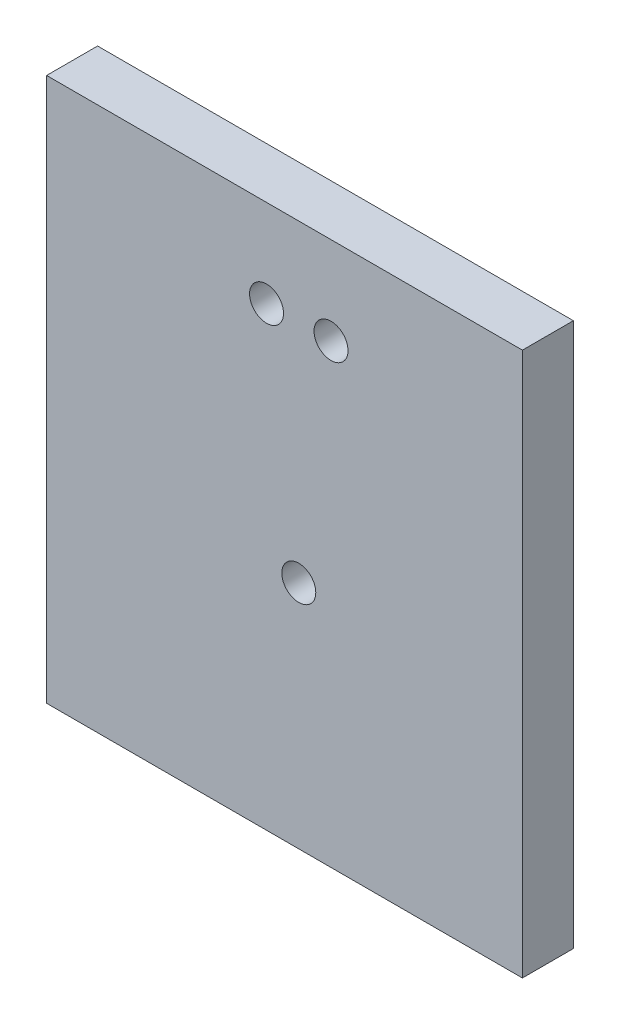
ISO-10303-21;
HEADER;
FILE_DESCRIPTION(('STEP AP214'),'2;1');
FILE_NAME('part.step','',(''),(''),'','','');
FILE_SCHEMA(('AUTOMOTIVE_DESIGN { 1 0 10303 214 1 1 1 1 }'));
ENDSEC;
DATA;
#1=APPLICATION_CONTEXT('core data for automotive mechanical design processes');
#2=APPLICATION_PROTOCOL_DEFINITION('international standard','automotive_design',2000,#1);
#3=PRODUCT_CONTEXT('',#1,'mechanical');
#4=PRODUCT('Part','Part','',(#3));
#5=PRODUCT_RELATED_PRODUCT_CATEGORY('part','',(#4));
#6=PRODUCT_DEFINITION_FORMATION('','',#4);
#7=PRODUCT_DEFINITION_CONTEXT('part definition',#1,'design');
#8=PRODUCT_DEFINITION('design','',#6,#7);
#9=PRODUCT_DEFINITION_SHAPE('','',#8);
#10=(LENGTH_UNIT() NAMED_UNIT(*) SI_UNIT(.MILLI.,.METRE.));
#11=(NAMED_UNIT(*) PLANE_ANGLE_UNIT() SI_UNIT($,.RADIAN.));
#12=(NAMED_UNIT(*) SI_UNIT($,.STERADIAN.) SOLID_ANGLE_UNIT());
#13=UNCERTAINTY_MEASURE_WITH_UNIT(LENGTH_MEASURE(1.E-05),#10,'distance_accuracy_value','');
#14=(GEOMETRIC_REPRESENTATION_CONTEXT(3) GLOBAL_UNCERTAINTY_ASSIGNED_CONTEXT((#13)) GLOBAL_UNIT_ASSIGNED_CONTEXT((#10,
#11,#12)) REPRESENTATION_CONTEXT('',''));
#15=CARTESIAN_POINT('',(0.,0.,0.));
#16=DIRECTION('',(0.,0.,1.));
#17=DIRECTION('',(1.,0.,0.));
#18=AXIS2_PLACEMENT_3D('',#15,#16,#17);
#19=CARTESIAN_POINT('',(0.,0.,9.525));
#20=DIRECTION('',(-1.,0.,0.));
#21=DIRECTION('',(0.,-1.,0.));
#22=AXIS2_PLACEMENT_3D('',#19,#20,#21);
#23=PLANE('',#22);
#24=DIRECTION('',(0.,1.,0.));
#25=VECTOR('',#24,1.);
#26=CARTESIAN_POINT('',(0.,0.,0.));
#27=LINE('',#26,#25);
#28=CARTESIAN_POINT('',(0.,0.,0.));
#29=VERTEX_POINT('',#28);
#30=CARTESIAN_POINT('',(0.,101.6,0.));
#31=VERTEX_POINT('',#30);
#32=EDGE_CURVE('E96',#29,#31,#27,.T.);
#33=ORIENTED_EDGE('',*,*,#32,.T.);
#34=DIRECTION('',(0.,0.,-1.));
#35=VECTOR('',#34,1.);
#36=CARTESIAN_POINT('',(0.,101.6,9.525));
#37=LINE('',#36,#35);
#38=CARTESIAN_POINT('',(0.,101.6,9.525));
#39=VERTEX_POINT('',#38);
#40=EDGE_CURVE('E11',#39,#31,#37,.T.);
#41=ORIENTED_EDGE('',*,*,#40,.F.);
#42=DIRECTION('',(0.,1.,0.));
#43=VECTOR('',#42,1.);
#44=CARTESIAN_POINT('',(0.,0.,9.525));
#45=LINE('',#44,#43);
#46=CARTESIAN_POINT('',(0.,0.,9.525));
#47=VERTEX_POINT('',#46);
#48=EDGE_CURVE('E84',#47,#39,#45,.T.);
#49=ORIENTED_EDGE('',*,*,#48,.F.);
#50=DIRECTION('',(0.,0.,-1.));
#51=VECTOR('',#50,1.);
#52=CARTESIAN_POINT('',(0.,0.,9.525));
#53=LINE('',#52,#51);
#54=EDGE_CURVE('E92',#47,#29,#53,.T.);
#55=ORIENTED_EDGE('',*,*,#54,.T.);
#56=EDGE_LOOP('',(#33,#41,#49,#55));
#57=FACE_BOUND('',#56,.T.);
#58=ADVANCED_FACE('F33',(#57),#23,.F.);
#59=CARTESIAN_POINT('',(0.,101.6,9.525));
#60=DIRECTION('',(0.,-1.,0.));
#61=DIRECTION('',(1.,0.,0.));
#62=AXIS2_PLACEMENT_3D('',#59,#60,#61);
#63=PLANE('',#62);
#64=DIRECTION('',(-1.,0.,0.));
#65=VECTOR('',#64,1.);
#66=CARTESIAN_POINT('',(0.,101.6,0.));
#67=LINE('',#66,#65);
#68=CARTESIAN_POINT('',(-88.9,101.6,0.));
#69=VERTEX_POINT('',#68);
#70=EDGE_CURVE('E88',#31,#69,#67,.T.);
#71=ORIENTED_EDGE('',*,*,#70,.T.);
#72=DIRECTION('',(0.,0.,-1.));
#73=VECTOR('',#72,1.);
#74=CARTESIAN_POINT('',(-88.9,101.6,9.525));
#75=LINE('',#74,#73);
#76=CARTESIAN_POINT('',(-88.9,101.6,9.525));
#77=VERTEX_POINT('',#76);
#78=EDGE_CURVE('E41',#77,#69,#75,.T.);
#79=ORIENTED_EDGE('',*,*,#78,.F.);
#80=DIRECTION('',(-1.,0.,0.));
#81=VECTOR('',#80,1.);
#82=CARTESIAN_POINT('',(0.,101.6,9.525));
#83=LINE('',#82,#81);
#84=EDGE_CURVE('E79',#39,#77,#83,.T.);
#85=ORIENTED_EDGE('',*,*,#84,.F.);
#86=ORIENTED_EDGE('',*,*,#40,.T.);
#87=EDGE_LOOP('',(#71,#79,#85,#86));
#88=FACE_BOUND('',#87,.T.);
#89=ADVANCED_FACE('F87',(#88),#63,.F.);
#90=CARTESIAN_POINT('',(-88.9,0.,9.525));
#91=DIRECTION('',(1.,0.,0.));
#92=DIRECTION('',(0.,0.,-1.));
#93=AXIS2_PLACEMENT_3D('',#90,#91,#92);
#94=PLANE('',#93);
#95=DIRECTION('',(0.,-1.,0.));
#96=VECTOR('',#95,1.);
#97=CARTESIAN_POINT('',(-88.9,0.,0.));
#98=LINE('',#97,#96);
#99=CARTESIAN_POINT('',(-88.9,0.,0.));
#100=VERTEX_POINT('',#99);
#101=EDGE_CURVE('E66',#69,#100,#98,.T.);
#102=ORIENTED_EDGE('',*,*,#101,.T.);
#103=DIRECTION('',(0.,0.,-1.));
#104=VECTOR('',#103,1.);
#105=CARTESIAN_POINT('',(-88.9,0.,9.525));
#106=LINE('',#105,#104);
#107=CARTESIAN_POINT('',(-88.9,0.,9.525));
#108=VERTEX_POINT('',#107);
#109=EDGE_CURVE('E89',#108,#100,#106,.T.);
#110=ORIENTED_EDGE('',*,*,#109,.F.);
#111=DIRECTION('',(0.,-1.,0.));
#112=VECTOR('',#111,1.);
#113=CARTESIAN_POINT('',(-88.9,0.,9.525));
#114=LINE('',#113,#112);
#115=EDGE_CURVE('E82',#77,#108,#114,.T.);
#116=ORIENTED_EDGE('',*,*,#115,.F.);
#117=ORIENTED_EDGE('',*,*,#78,.T.);
#118=EDGE_LOOP('',(#102,#110,#116,#117));
#119=FACE_BOUND('',#118,.T.);
#120=ADVANCED_FACE('F90',(#119),#94,.F.);
#121=CARTESIAN_POINT('',(0.,0.,9.525));
#122=DIRECTION('',(0.,1.,0.));
#123=DIRECTION('',(-1.,0.,0.));
#124=AXIS2_PLACEMENT_3D('',#121,#122,#123);
#125=PLANE('',#124);
#126=DIRECTION('',(1.,0.,0.));
#127=VECTOR('',#126,1.);
#128=CARTESIAN_POINT('',(0.,0.,0.));
#129=LINE('',#128,#127);
#130=EDGE_CURVE('E72',#100,#29,#129,.T.);
#131=ORIENTED_EDGE('',*,*,#130,.T.);
#132=ORIENTED_EDGE('',*,*,#54,.F.);
#133=DIRECTION('',(1.,0.,0.));
#134=VECTOR('',#133,1.);
#135=CARTESIAN_POINT('',(0.,0.,9.525));
#136=LINE('',#135,#134);
#137=EDGE_CURVE('E49',#108,#47,#136,.T.);
#138=ORIENTED_EDGE('',*,*,#137,.F.);
#139=ORIENTED_EDGE('',*,*,#109,.T.);
#140=EDGE_LOOP('',(#131,#132,#138,#139));
#141=FACE_BOUND('',#140,.T.);
#142=ADVANCED_FACE('F104',(#141),#125,.F.);
#143=CARTESIAN_POINT('',(0.,0.,9.525));
#144=DIRECTION('',(0.,0.,1.));
#145=DIRECTION('',(1.,0.,0.));
#146=AXIS2_PLACEMENT_3D('',#143,#144,#145);
#147=PLANE('',#146);
#148=CARTESIAN_POINT('',(-47.807859020382,85.2202821492196,9.525));
#149=DIRECTION('',(0.,0.,1.));
#150=DIRECTION('',(1.,0.,0.));
#151=AXIS2_PLACEMENT_3D('',#148,#149,#150);
#152=CIRCLE('',#151,3.17499999999998);
#153=CARTESIAN_POINT('',(-44.6328590203821,85.2202821492196,9.525));
#154=VERTEX_POINT('',#153);
#155=EDGE_CURVE('E124',#154,#154,#152,.T.);
#156=ORIENTED_EDGE('',*,*,#155,.F.);
#157=EDGE_LOOP('',(#156));
#158=FACE_BOUND('',#157,.T.);
#159=CARTESIAN_POINT('',(-35.7595811351405,85.2202821492196,9.525));
#160=DIRECTION('',(0.,0.,1.));
#161=DIRECTION('',(1.,0.,0.));
#162=AXIS2_PLACEMENT_3D('',#159,#160,#161);
#163=CIRCLE('',#162,3.17499999999999);
#164=CARTESIAN_POINT('',(-32.5845811351405,85.2202821492196,9.525));
#165=VERTEX_POINT('',#164);
#166=EDGE_CURVE('E118',#165,#165,#163,.T.);
#167=ORIENTED_EDGE('',*,*,#166,.F.);
#168=EDGE_LOOP('',(#167));
#169=FACE_BOUND('',#168,.T.);
#170=CARTESIAN_POINT('',(-41.7837200777613,43.0513095508742,9.525));
#171=DIRECTION('',(0.,0.,1.));
#172=DIRECTION('',(1.,0.,0.));
#173=AXIS2_PLACEMENT_3D('',#170,#171,#172);
#174=CIRCLE('',#173,3.17499999999999);
#175=CARTESIAN_POINT('',(-38.6087200777613,43.0513095508742,9.525));
#176=VERTEX_POINT('',#175);
#177=EDGE_CURVE('E112',#176,#176,#174,.T.);
#178=ORIENTED_EDGE('',*,*,#177,.F.);
#179=EDGE_LOOP('',(#178));
#180=FACE_BOUND('',#179,.T.);
#181=ORIENTED_EDGE('',*,*,#48,.T.);
#182=ORIENTED_EDGE('',*,*,#84,.T.);
#183=ORIENTED_EDGE('',*,*,#115,.T.);
#184=ORIENTED_EDGE('',*,*,#137,.T.);
#185=EDGE_LOOP('',(#181,#182,#183,#184));
#186=FACE_BOUND('',#185,.T.);
#187=ADVANCED_FACE('F80',(#158,#169,#180,#186),#147,.T.);
#188=CARTESIAN_POINT('',(0.,0.,0.));
#189=DIRECTION('',(0.,0.,1.));
#190=DIRECTION('',(1.,0.,0.));
#191=AXIS2_PLACEMENT_3D('',#188,#189,#190);
#192=PLANE('',#191);
#193=CARTESIAN_POINT('',(-47.807859020382,85.2202821492196,0.));
#194=DIRECTION('',(0.,0.,1.));
#195=DIRECTION('',(1.,0.,0.));
#196=AXIS2_PLACEMENT_3D('',#193,#194,#195);
#197=CIRCLE('',#196,3.17499999999999);
#198=CARTESIAN_POINT('',(-44.632859020382,85.2202821492196,0.));
#199=VERTEX_POINT('',#198);
#200=EDGE_CURVE('E121',#199,#199,#197,.T.);
#201=ORIENTED_EDGE('',*,*,#200,.T.);
#202=EDGE_LOOP('',(#201));
#203=FACE_BOUND('',#202,.T.);
#204=CARTESIAN_POINT('',(-35.7595811351405,85.2202821492196,0.));
#205=DIRECTION('',(0.,0.,1.));
#206=DIRECTION('',(1.,0.,0.));
#207=AXIS2_PLACEMENT_3D('',#204,#205,#206);
#208=CIRCLE('',#207,3.17499999999999);
#209=CARTESIAN_POINT('',(-32.5845811351405,85.2202821492196,0.));
#210=VERTEX_POINT('',#209);
#211=EDGE_CURVE('E115',#210,#210,#208,.T.);
#212=ORIENTED_EDGE('',*,*,#211,.T.);
#213=EDGE_LOOP('',(#212));
#214=FACE_BOUND('',#213,.T.);
#215=CARTESIAN_POINT('',(-41.7837200777613,43.0513095508742,0.));
#216=DIRECTION('',(0.,0.,1.));
#217=DIRECTION('',(1.,0.,0.));
#218=AXIS2_PLACEMENT_3D('',#215,#216,#217);
#219=CIRCLE('',#218,3.17499999999999);
#220=CARTESIAN_POINT('',(-38.6087200777613,43.0513095508742,0.));
#221=VERTEX_POINT('',#220);
#222=EDGE_CURVE('E99',#221,#221,#219,.T.);
#223=ORIENTED_EDGE('',*,*,#222,.T.);
#224=EDGE_LOOP('',(#223));
#225=FACE_BOUND('',#224,.T.);
#226=ORIENTED_EDGE('',*,*,#32,.F.);
#227=ORIENTED_EDGE('',*,*,#130,.F.);
#228=ORIENTED_EDGE('',*,*,#101,.F.);
#229=ORIENTED_EDGE('',*,*,#70,.F.);
#230=EDGE_LOOP('',(#226,#227,#228,#229));
#231=FACE_BOUND('',#230,.T.);
#232=ADVANCED_FACE('F107',(#203,#214,#225,#231),#192,.F.);
#233=CARTESIAN_POINT('',(-41.7837200777613,43.0513095508742,9.525));
#234=DIRECTION('',(0.,0.,1.));
#235=DIRECTION('',(1.,0.,0.));
#236=AXIS2_PLACEMENT_3D('',#233,#234,#235);
#237=CYLINDRICAL_SURFACE('',#236,3.17499999999999);
#238=ORIENTED_EDGE('',*,*,#222,.F.);
#239=EDGE_LOOP('',(#238));
#240=FACE_BOUND('',#239,.T.);
#241=ORIENTED_EDGE('',*,*,#177,.T.);
#242=EDGE_LOOP('',(#241));
#243=FACE_BOUND('',#242,.T.);
#244=ADVANCED_FACE('F137',(#240,#243),#237,.F.);
#245=CARTESIAN_POINT('',(-35.7595811351405,85.2202821492196,9.525));
#246=DIRECTION('',(0.,0.,1.));
#247=DIRECTION('',(1.,0.,0.));
#248=AXIS2_PLACEMENT_3D('',#245,#246,#247);
#249=CYLINDRICAL_SURFACE('',#248,3.17499999999999);
#250=ORIENTED_EDGE('',*,*,#211,.F.);
#251=EDGE_LOOP('',(#250));
#252=FACE_BOUND('',#251,.T.);
#253=ORIENTED_EDGE('',*,*,#166,.T.);
#254=EDGE_LOOP('',(#253));
#255=FACE_BOUND('',#254,.T.);
#256=ADVANCED_FACE('F139',(#252,#255),#249,.F.);
#257=CARTESIAN_POINT('',(-47.807859020382,85.2202821492196,9.525));
#258=DIRECTION('',(0.,0.,1.));
#259=DIRECTION('',(1.,0.,0.));
#260=AXIS2_PLACEMENT_3D('',#257,#258,#259);
#261=CYLINDRICAL_SURFACE('',#260,3.17499999999999);
#262=ORIENTED_EDGE('',*,*,#200,.F.);
#263=EDGE_LOOP('',(#262));
#264=FACE_BOUND('',#263,.T.);
#265=ORIENTED_EDGE('',*,*,#155,.T.);
#266=EDGE_LOOP('',(#265));
#267=FACE_BOUND('',#266,.T.);
#268=ADVANCED_FACE('F128',(#264,#267),#261,.F.);
#269=CLOSED_SHELL('',(#58,#89,#120,#142,#187,#232,#244,#256,#268));
#270=MANIFOLD_SOLID_BREP('B2',#269);
#271=ADVANCED_BREP_SHAPE_REPRESENTATION('',(#18,#270),#14);
#272=SHAPE_DEFINITION_REPRESENTATION(#9,#271);
ENDSEC;
END-ISO-10303-21;
